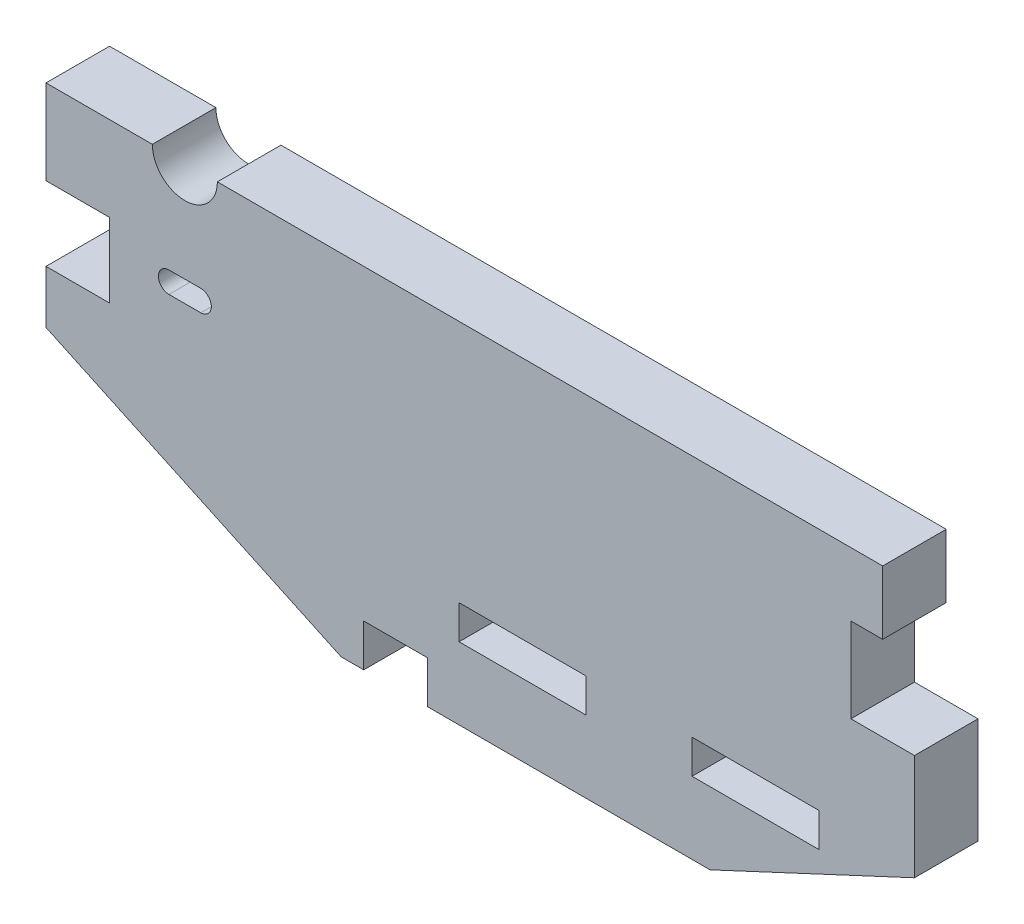
ISO-10303-21;
HEADER;
FILE_DESCRIPTION(('STEP AP214'),'2;1');
FILE_NAME('part.step','',(''),(''),'','','');
FILE_SCHEMA(('AUTOMOTIVE_DESIGN { 1 0 10303 214 1 1 1 1 }'));
ENDSEC;
DATA;
#1=APPLICATION_CONTEXT('core data for automotive mechanical design processes');
#2=APPLICATION_PROTOCOL_DEFINITION('international standard','automotive_design',2000,#1);
#3=PRODUCT_CONTEXT('',#1,'mechanical');
#4=PRODUCT('Part','Part','',(#3));
#5=PRODUCT_RELATED_PRODUCT_CATEGORY('part','',(#4));
#6=PRODUCT_DEFINITION_FORMATION('','',#4);
#7=PRODUCT_DEFINITION_CONTEXT('part definition',#1,'design');
#8=PRODUCT_DEFINITION('design','',#6,#7);
#9=PRODUCT_DEFINITION_SHAPE('','',#8);
#10=(LENGTH_UNIT() NAMED_UNIT(*) SI_UNIT(.MILLI.,.METRE.));
#11=(NAMED_UNIT(*) PLANE_ANGLE_UNIT() SI_UNIT($,.RADIAN.));
#12=(NAMED_UNIT(*) SI_UNIT($,.STERADIAN.) SOLID_ANGLE_UNIT());
#13=UNCERTAINTY_MEASURE_WITH_UNIT(LENGTH_MEASURE(1.E-05),#10,'distance_accuracy_value','');
#14=(GEOMETRIC_REPRESENTATION_CONTEXT(3) GLOBAL_UNCERTAINTY_ASSIGNED_CONTEXT((#13)) GLOBAL_UNIT_ASSIGNED_CONTEXT((#10,
#11,#12)) REPRESENTATION_CONTEXT('',''));
#15=CARTESIAN_POINT('',(0.,0.,0.));
#16=DIRECTION('',(0.,0.,1.));
#17=DIRECTION('',(1.,0.,0.));
#18=AXIS2_PLACEMENT_3D('',#15,#16,#17);
#19=CARTESIAN_POINT('',(0.,0.,6.));
#20=DIRECTION('',(0.,1.,0.));
#21=DIRECTION('',(0.,0.,1.));
#22=AXIS2_PLACEMENT_3D('',#19,#20,#21);
#23=PLANE('',#22);
#24=DIRECTION('',(1.,0.,0.));
#25=VECTOR('',#24,1.);
#26=CARTESIAN_POINT('',(0.,0.,0.));
#27=LINE('',#26,#25);
#28=CARTESIAN_POINT('',(27.8785899666242,0.,0.));
#29=VERTEX_POINT('',#28);
#30=CARTESIAN_POINT('',(30.0000000000057,0.,0.));
#31=VERTEX_POINT('',#30);
#32=EDGE_CURVE('E412',#29,#31,#27,.T.);
#33=ORIENTED_EDGE('',*,*,#32,.T.);
#34=DIRECTION('',(0.,0.,1.));
#35=VECTOR('',#34,1.);
#36=CARTESIAN_POINT('',(30.0000000000057,0.,6.));
#37=LINE('',#36,#35);
#38=CARTESIAN_POINT('',(30.0000000000057,0.,6.));
#39=VERTEX_POINT('',#38);
#40=EDGE_CURVE('E257',#31,#39,#37,.T.);
#41=ORIENTED_EDGE('',*,*,#40,.T.);
#42=DIRECTION('',(1.,0.,0.));
#43=VECTOR('',#42,1.);
#44=CARTESIAN_POINT('',(0.,0.,6.));
#45=LINE('',#44,#43);
#46=CARTESIAN_POINT('',(27.8785899666242,0.,6.));
#47=VERTEX_POINT('',#46);
#48=EDGE_CURVE('E398',#47,#39,#45,.T.);
#49=ORIENTED_EDGE('',*,*,#48,.F.);
#50=DIRECTION('',(0.,0.,-1.));
#51=VECTOR('',#50,1.);
#52=CARTESIAN_POINT('',(27.8785899666242,0.,6.));
#53=LINE('',#52,#51);
#54=EDGE_CURVE('E431',#47,#29,#53,.T.);
#55=ORIENTED_EDGE('',*,*,#54,.T.);
#56=EDGE_LOOP('',(#33,#41,#49,#55));
#57=FACE_BOUND('',#56,.T.);
#58=ADVANCED_FACE('F35',(#57),#23,.F.);
#59=CARTESIAN_POINT('',(0.,33.,6.));
#60=DIRECTION('',(0.,-1.,0.));
#61=DIRECTION('',(0.,0.,-1.));
#62=AXIS2_PLACEMENT_3D('',#59,#60,#61);
#63=PLANE('',#62);
#64=DIRECTION('',(-1.,0.,0.));
#65=VECTOR('',#64,1.);
#66=CARTESIAN_POINT('',(0.,33.,0.));
#67=LINE('',#66,#65);
#68=CARTESIAN_POINT('',(79.,33.,0.));
#69=VERTEX_POINT('',#68);
#70=CARTESIAN_POINT('',(16.1803487705082,33.,0.));
#71=VERTEX_POINT('',#70);
#72=EDGE_CURVE('E417',#69,#71,#67,.T.);
#73=ORIENTED_EDGE('',*,*,#72,.T.);
#74=DIRECTION('',(0.,0.,1.));
#75=VECTOR('',#74,1.);
#76=CARTESIAN_POINT('',(16.1803487705082,33.,-4.));
#77=LINE('',#76,#75);
#78=CARTESIAN_POINT('',(16.1803487705082,33.,6.));
#79=VERTEX_POINT('',#78);
#80=EDGE_CURVE('E300',#71,#79,#77,.T.);
#81=ORIENTED_EDGE('',*,*,#80,.T.);
#82=DIRECTION('',(-1.,0.,0.));
#83=VECTOR('',#82,1.);
#84=CARTESIAN_POINT('',(0.,33.,6.));
#85=LINE('',#84,#83);
#86=CARTESIAN_POINT('',(79.,33.,6.));
#87=VERTEX_POINT('',#86);
#88=EDGE_CURVE('E404',#87,#79,#85,.T.);
#89=ORIENTED_EDGE('',*,*,#88,.F.);
#90=DIRECTION('',(0.,0.,1.));
#91=VECTOR('',#90,1.);
#92=CARTESIAN_POINT('',(79.,33.,-4.));
#93=LINE('',#92,#91);
#94=EDGE_CURVE('E381',#69,#87,#93,.T.);
#95=ORIENTED_EDGE('',*,*,#94,.F.);
#96=EDGE_LOOP('',(#73,#81,#89,#95));
#97=FACE_BOUND('',#96,.T.);
#98=ADVANCED_FACE('F508',(#97),#63,.F.);
#99=CARTESIAN_POINT('',(0.,0.,6.));
#100=DIRECTION('',(1.,0.,0.));
#101=DIRECTION('',(0.,0.,-1.));
#102=AXIS2_PLACEMENT_3D('',#99,#100,#101);
#103=PLANE('',#102);
#104=DIRECTION('',(0.,-1.,0.));
#105=VECTOR('',#104,1.);
#106=CARTESIAN_POINT('',(0.,0.,0.));
#107=LINE('',#106,#105);
#108=CARTESIAN_POINT('',(0.,33.,0.));
#109=VERTEX_POINT('',#108);
#110=CARTESIAN_POINT('',(0.,25.,0.));
#111=VERTEX_POINT('',#110);
#112=EDGE_CURVE('E408',#109,#111,#107,.T.);
#113=ORIENTED_EDGE('',*,*,#112,.T.);
#114=DIRECTION('',(0.,0.,1.));
#115=VECTOR('',#114,1.);
#116=CARTESIAN_POINT('',(0.,25.,0.));
#117=LINE('',#116,#115);
#118=CARTESIAN_POINT('',(0.,25.,6.));
#119=VERTEX_POINT('',#118);
#120=EDGE_CURVE('E361',#111,#119,#117,.T.);
#121=ORIENTED_EDGE('',*,*,#120,.T.);
#122=DIRECTION('',(0.,-1.,0.));
#123=VECTOR('',#122,1.);
#124=CARTESIAN_POINT('',(0.,0.,6.));
#125=LINE('',#124,#123);
#126=CARTESIAN_POINT('',(0.,33.,6.));
#127=VERTEX_POINT('',#126);
#128=EDGE_CURVE('E393',#127,#119,#125,.T.);
#129=ORIENTED_EDGE('',*,*,#128,.F.);
#130=DIRECTION('',(0.,0.,-1.));
#131=VECTOR('',#130,1.);
#132=CARTESIAN_POINT('',(0.,33.,6.));
#133=LINE('',#132,#131);
#134=EDGE_CURVE('E407',#127,#109,#133,.T.);
#135=ORIENTED_EDGE('',*,*,#134,.T.);
#136=EDGE_LOOP('',(#113,#121,#129,#135));
#137=FACE_BOUND('',#136,.T.);
#138=ADVANCED_FACE('F515',(#137),#103,.F.);
#139=CARTESIAN_POINT('',(0.,18.,0.));
#140=VERTEX_POINT('',#139);
#141=CARTESIAN_POINT('',(0.,13.,0.));
#142=VERTEX_POINT('',#141);
#143=EDGE_CURVE('E385',#140,#142,#107,.T.);
#144=ORIENTED_EDGE('',*,*,#143,.T.);
#145=DIRECTION('',(0.,0.,1.));
#146=VECTOR('',#145,1.);
#147=CARTESIAN_POINT('',(0.,13.,6.));
#148=LINE('',#147,#146);
#149=CARTESIAN_POINT('',(0.,13.,6.));
#150=VERTEX_POINT('',#149);
#151=EDGE_CURVE('E436',#142,#150,#148,.T.);
#152=ORIENTED_EDGE('',*,*,#151,.T.);
#153=CARTESIAN_POINT('',(0.,18.,6.));
#154=VERTEX_POINT('',#153);
#155=EDGE_CURVE('E397',#154,#150,#125,.T.);
#156=ORIENTED_EDGE('',*,*,#155,.F.);
#157=DIRECTION('',(0.,0.,1.));
#158=VECTOR('',#157,1.);
#159=CARTESIAN_POINT('',(0.,18.,0.));
#160=LINE('',#159,#158);
#161=EDGE_CURVE('E354',#140,#154,#160,.T.);
#162=ORIENTED_EDGE('',*,*,#161,.F.);
#163=EDGE_LOOP('',(#144,#152,#156,#162));
#164=FACE_BOUND('',#163,.T.);
#165=ADVANCED_FACE('F523',(#164),#103,.F.);
#166=CARTESIAN_POINT('',(36.0000000000057,0.,6.));
#167=VERTEX_POINT('',#166);
#168=CARTESIAN_POINT('',(62.699437715414,0.,6.));
#169=VERTEX_POINT('',#168);
#170=EDGE_CURVE('E396',#167,#169,#45,.T.);
#171=ORIENTED_EDGE('',*,*,#170,.F.);
#172=DIRECTION('',(0.,0.,-1.));
#173=VECTOR('',#172,1.);
#174=CARTESIAN_POINT('',(36.0000000000057,0.,6.));
#175=LINE('',#174,#173);
#176=CARTESIAN_POINT('',(36.0000000000057,0.,0.));
#177=VERTEX_POINT('',#176);
#178=EDGE_CURVE('E250',#167,#177,#175,.T.);
#179=ORIENTED_EDGE('',*,*,#178,.T.);
#180=CARTESIAN_POINT('',(62.699437715414,0.,0.));
#181=VERTEX_POINT('',#180);
#182=EDGE_CURVE('E411',#177,#181,#27,.T.);
#183=ORIENTED_EDGE('',*,*,#182,.T.);
#184=DIRECTION('',(0.,0.,1.));
#185=VECTOR('',#184,1.);
#186=CARTESIAN_POINT('',(62.699437715414,0.,6.));
#187=LINE('',#186,#185);
#188=EDGE_CURVE('E446',#181,#169,#187,.T.);
#189=ORIENTED_EDGE('',*,*,#188,.T.);
#190=EDGE_LOOP('',(#171,#179,#183,#189));
#191=FACE_BOUND('',#190,.T.);
#192=ADVANCED_FACE('F511',(#191),#23,.F.);
#193=CARTESIAN_POINT('',(82.,0.,6.));
#194=DIRECTION('',(-1.,0.,0.));
#195=DIRECTION('',(0.,0.,1.));
#196=AXIS2_PLACEMENT_3D('',#193,#194,#195);
#197=PLANE('',#196);
#198=DIRECTION('',(0.,1.,0.));
#199=VECTOR('',#198,1.);
#200=CARTESIAN_POINT('',(82.,0.,6.));
#201=LINE('',#200,#199);
#202=CARTESIAN_POINT('',(82.,9.00000000000001,6.));
#203=VERTEX_POINT('',#202);
#204=CARTESIAN_POINT('',(82.,19.,6.));
#205=VERTEX_POINT('',#204);
#206=EDGE_CURVE('E401',#203,#205,#201,.T.);
#207=ORIENTED_EDGE('',*,*,#206,.F.);
#208=DIRECTION('',(0.,0.,-1.));
#209=VECTOR('',#208,1.);
#210=CARTESIAN_POINT('',(82.,9.00000000000001,6.));
#211=LINE('',#210,#209);
#212=CARTESIAN_POINT('',(82.,9.00000000000001,0.));
#213=VERTEX_POINT('',#212);
#214=EDGE_CURVE('E440',#203,#213,#211,.T.);
#215=ORIENTED_EDGE('',*,*,#214,.T.);
#216=DIRECTION('',(0.,1.,0.));
#217=VECTOR('',#216,1.);
#218=CARTESIAN_POINT('',(82.,0.,0.));
#219=LINE('',#218,#217);
#220=CARTESIAN_POINT('',(82.,19.,0.));
#221=VERTEX_POINT('',#220);
#222=EDGE_CURVE('E414',#213,#221,#219,.T.);
#223=ORIENTED_EDGE('',*,*,#222,.T.);
#224=DIRECTION('',(0.,0.,1.));
#225=VECTOR('',#224,1.);
#226=CARTESIAN_POINT('',(82.,19.,-4.));
#227=LINE('',#226,#225);
#228=EDGE_CURVE('E382',#221,#205,#227,.T.);
#229=ORIENTED_EDGE('',*,*,#228,.T.);
#230=EDGE_LOOP('',(#207,#215,#223,#229));
#231=FACE_BOUND('',#230,.T.);
#232=ADVANCED_FACE('F522',(#231),#197,.F.);
#233=CARTESIAN_POINT('',(10.0402513180558,33.,6.));
#234=VERTEX_POINT('',#233);
#235=EDGE_CURVE('E403',#234,#127,#85,.T.);
#236=ORIENTED_EDGE('',*,*,#235,.F.);
#237=DIRECTION('',(0.,0.,1.));
#238=VECTOR('',#237,1.);
#239=CARTESIAN_POINT('',(10.0402513180558,33.,-4.));
#240=LINE('',#239,#238);
#241=CARTESIAN_POINT('',(10.0402513180558,33.,0.));
#242=VERTEX_POINT('',#241);
#243=EDGE_CURVE('E291',#234,#242,#240,.F.);
#244=ORIENTED_EDGE('',*,*,#243,.T.);
#245=EDGE_CURVE('E416',#242,#109,#67,.T.);
#246=ORIENTED_EDGE('',*,*,#245,.T.);
#247=ORIENTED_EDGE('',*,*,#134,.F.);
#248=EDGE_LOOP('',(#236,#244,#246,#247));
#249=FACE_BOUND('',#248,.T.);
#250=ADVANCED_FACE('F518',(#249),#63,.F.);
#251=CARTESIAN_POINT('',(0.,0.,6.));
#252=DIRECTION('',(0.,0.,-1.));
#253=DIRECTION('',(-1.,0.,0.));
#254=AXIS2_PLACEMENT_3D('',#251,#252,#253);
#255=PLANE('',#254);
#256=DIRECTION('',(1.,0.,0.));
#257=VECTOR('',#256,1.);
#258=CARTESIAN_POINT('',(11.610300044282,21.5090873537113,6.));
#259=LINE('',#258,#257);
#260=CARTESIAN_POINT('',(11.610300044282,21.5090873537113,6.));
#261=VERTEX_POINT('',#260);
#262=CARTESIAN_POINT('',(14.610300044282,21.5090873537113,6.));
#263=VERTEX_POINT('',#262);
#264=EDGE_CURVE('E279',#261,#263,#259,.T.);
#265=ORIENTED_EDGE('',*,*,#264,.F.);
#266=CARTESIAN_POINT('',(11.610300044282,22.5090873537113,6.));
#267=DIRECTION('',(0.,0.,1.));
#268=DIRECTION('',(1.,0.,0.));
#269=AXIS2_PLACEMENT_3D('',#266,#267,#268);
#270=CIRCLE('',#269,1.);
#271=CARTESIAN_POINT('',(11.610300044282,23.5090873537113,6.));
#272=VERTEX_POINT('',#271);
#273=EDGE_CURVE('E58',#272,#261,#270,.T.);
#274=ORIENTED_EDGE('',*,*,#273,.F.);
#275=DIRECTION('',(-1.,0.,0.));
#276=VECTOR('',#275,1.);
#277=CARTESIAN_POINT('',(11.610300044282,23.5090873537113,6.));
#278=LINE('',#277,#276);
#279=CARTESIAN_POINT('',(14.610300044282,23.5090873537113,6.));
#280=VERTEX_POINT('',#279);
#281=EDGE_CURVE('E285',#280,#272,#278,.T.);
#282=ORIENTED_EDGE('',*,*,#281,.F.);
#283=CARTESIAN_POINT('',(14.610300044282,22.5090873537113,6.));
#284=DIRECTION('',(0.,0.,1.));
#285=DIRECTION('',(1.,0.,0.));
#286=AXIS2_PLACEMENT_3D('',#283,#284,#285);
#287=CIRCLE('',#286,1.);
#288=EDGE_CURVE('E282',#263,#280,#287,.T.);
#289=ORIENTED_EDGE('',*,*,#288,.F.);
#290=EDGE_LOOP('',(#265,#274,#282,#289));
#291=FACE_BOUND('',#290,.T.);
#292=DIRECTION('',(1.,0.,0.));
#293=VECTOR('',#292,1.);
#294=CARTESIAN_POINT('',(61.0000000000057,6.79999999998872,6.));
#295=LINE('',#294,#293);
#296=CARTESIAN_POINT('',(61.0000000000057,6.79999999998872,6.));
#297=VERTEX_POINT('',#296);
#298=CARTESIAN_POINT('',(73.0000000000057,6.79999999998872,6.));
#299=VERTEX_POINT('',#298);
#300=EDGE_CURVE('E305',#297,#299,#295,.T.);
#301=ORIENTED_EDGE('',*,*,#300,.F.);
#302=DIRECTION('',(0.,-1.,0.));
#303=VECTOR('',#302,1.);
#304=CARTESIAN_POINT('',(61.0000000000057,9.99999999998872,6.));
#305=LINE('',#304,#303);
#306=CARTESIAN_POINT('',(61.0000000000057,9.99999999998872,6.));
#307=VERTEX_POINT('',#306);
#308=EDGE_CURVE('E303',#307,#297,#305,.T.);
#309=ORIENTED_EDGE('',*,*,#308,.F.);
#310=DIRECTION('',(-1.,0.,0.));
#311=VECTOR('',#310,1.);
#312=CARTESIAN_POINT('',(61.0000000000057,9.99999999998872,6.));
#313=LINE('',#312,#311);
#314=CARTESIAN_POINT('',(73.0000000000057,9.99999999998872,6.));
#315=VERTEX_POINT('',#314);
#316=EDGE_CURVE('E311',#315,#307,#313,.T.);
#317=ORIENTED_EDGE('',*,*,#316,.F.);
#318=DIRECTION('',(0.,1.,0.));
#319=VECTOR('',#318,1.);
#320=CARTESIAN_POINT('',(73.0000000000057,9.99999999998872,6.));
#321=LINE('',#320,#319);
#322=EDGE_CURVE('E308',#299,#315,#321,.T.);
#323=ORIENTED_EDGE('',*,*,#322,.F.);
#324=EDGE_LOOP('',(#301,#309,#317,#323));
#325=FACE_BOUND('',#324,.T.);
#326=DIRECTION('',(1.,0.,0.));
#327=VECTOR('',#326,1.);
#328=CARTESIAN_POINT('',(39.0000000000057,6.79999999998872,6.));
#329=LINE('',#328,#327);
#330=CARTESIAN_POINT('',(39.0000000000057,6.79999999998872,6.));
#331=VERTEX_POINT('',#330);
#332=CARTESIAN_POINT('',(51.0000000000057,6.79999999998872,6.));
#333=VERTEX_POINT('',#332);
#334=EDGE_CURVE('E325',#331,#333,#329,.T.);
#335=ORIENTED_EDGE('',*,*,#334,.F.);
#336=DIRECTION('',(0.,-1.,0.));
#337=VECTOR('',#336,1.);
#338=CARTESIAN_POINT('',(39.0000000000057,9.99999999998872,6.));
#339=LINE('',#338,#337);
#340=CARTESIAN_POINT('',(39.0000000000057,9.99999999998872,6.));
#341=VERTEX_POINT('',#340);
#342=EDGE_CURVE('E317',#341,#331,#339,.T.);
#343=ORIENTED_EDGE('',*,*,#342,.F.);
#344=DIRECTION('',(-1.,0.,0.));
#345=VECTOR('',#344,1.);
#346=CARTESIAN_POINT('',(39.0000000000057,9.99999999998872,6.));
#347=LINE('',#346,#345);
#348=CARTESIAN_POINT('',(51.0000000000057,9.99999999998872,6.));
#349=VERTEX_POINT('',#348);
#350=EDGE_CURVE('E331',#349,#341,#347,.T.);
#351=ORIENTED_EDGE('',*,*,#350,.F.);
#352=DIRECTION('',(0.,1.,0.));
#353=VECTOR('',#352,1.);
#354=CARTESIAN_POINT('',(51.0000000000057,9.99999999998872,6.));
#355=LINE('',#354,#353);
#356=EDGE_CURVE('E328',#333,#349,#355,.T.);
#357=ORIENTED_EDGE('',*,*,#356,.F.);
#358=EDGE_LOOP('',(#335,#343,#351,#357));
#359=FACE_BOUND('',#358,.T.);
#360=ORIENTED_EDGE('',*,*,#48,.T.);
#361=DIRECTION('',(0.,-1.,0.));
#362=VECTOR('',#361,1.);
#363=CARTESIAN_POINT('',(30.0000000000058,-5.00000000000955,6.));
#364=LINE('',#363,#362);
#365=CARTESIAN_POINT('',(30.0000000000056,4.,6.));
#366=VERTEX_POINT('',#365);
#367=EDGE_CURVE('E269',#366,#39,#364,.T.);
#368=ORIENTED_EDGE('',*,*,#367,.F.);
#369=DIRECTION('',(-1.,0.,0.));
#370=VECTOR('',#369,1.);
#371=CARTESIAN_POINT('',(30.0000000000056,4.,6.));
#372=LINE('',#371,#370);
#373=CARTESIAN_POINT('',(36.0000000000056,4.,6.));
#374=VERTEX_POINT('',#373);
#375=EDGE_CURVE('E247',#374,#366,#372,.T.);
#376=ORIENTED_EDGE('',*,*,#375,.F.);
#377=DIRECTION('',(0.,1.,0.));
#378=VECTOR('',#377,1.);
#379=CARTESIAN_POINT('',(36.0000000000057,-5.00000000000955,6.));
#380=LINE('',#379,#378);
#381=EDGE_CURVE('E271',#167,#374,#380,.T.);
#382=ORIENTED_EDGE('',*,*,#381,.F.);
#383=ORIENTED_EDGE('',*,*,#170,.T.);
#384=DIRECTION('',(-0.90630778703665,-0.4226182617407,0.));
#385=VECTOR('',#384,1.);
#386=CARTESIAN_POINT('',(82.,9.00000000000001,6.));
#387=LINE('',#386,#385);
#388=EDGE_CURVE('E449',#169,#203,#387,.F.);
#389=ORIENTED_EDGE('',*,*,#388,.T.);
#390=ORIENTED_EDGE('',*,*,#206,.T.);
#391=DIRECTION('',(1.,0.,0.));
#392=VECTOR('',#391,1.);
#393=CARTESIAN_POINT('',(76.,19.,6.));
#394=LINE('',#393,#392);
#395=CARTESIAN_POINT('',(76.,19.,6.));
#396=VERTEX_POINT('',#395);
#397=EDGE_CURVE('E378',#396,#205,#394,.T.);
#398=ORIENTED_EDGE('',*,*,#397,.F.);
#399=DIRECTION('',(0.,-1.,0.));
#400=VECTOR('',#399,1.);
#401=CARTESIAN_POINT('',(76.,27.,6.));
#402=LINE('',#401,#400);
#403=CARTESIAN_POINT('',(76.,27.,6.));
#404=VERTEX_POINT('',#403);
#405=EDGE_CURVE('E375',#404,#396,#402,.T.);
#406=ORIENTED_EDGE('',*,*,#405,.F.);
#407=DIRECTION('',(-1.,0.,0.));
#408=VECTOR('',#407,1.);
#409=CARTESIAN_POINT('',(79.,27.,6.));
#410=LINE('',#409,#408);
#411=CARTESIAN_POINT('',(79.,27.,6.));
#412=VERTEX_POINT('',#411);
#413=EDGE_CURVE('E372',#412,#404,#410,.T.);
#414=ORIENTED_EDGE('',*,*,#413,.F.);
#415=DIRECTION('',(0.,-1.,0.));
#416=VECTOR('',#415,1.);
#417=CARTESIAN_POINT('',(79.,33.,6.));
#418=LINE('',#417,#416);
#419=EDGE_CURVE('E364',#87,#412,#418,.T.);
#420=ORIENTED_EDGE('',*,*,#419,.F.);
#421=ORIENTED_EDGE('',*,*,#88,.T.);
#422=CARTESIAN_POINT('',(13.110300044282,33.,6.));
#423=DIRECTION('',(0.,0.,1.));
#424=DIRECTION('',(1.,0.,0.));
#425=AXIS2_PLACEMENT_3D('',#422,#423,#424);
#426=CIRCLE('',#425,3.07004872622623);
#427=EDGE_CURVE('E277',#234,#79,#426,.T.);
#428=ORIENTED_EDGE('',*,*,#427,.F.);
#429=ORIENTED_EDGE('',*,*,#235,.T.);
#430=ORIENTED_EDGE('',*,*,#128,.T.);
#431=DIRECTION('',(-1.,0.,0.));
#432=VECTOR('',#431,1.);
#433=CARTESIAN_POINT('',(0.,25.,6.));
#434=LINE('',#433,#432);
#435=CARTESIAN_POINT('',(6.,25.,6.));
#436=VERTEX_POINT('',#435);
#437=EDGE_CURVE('E348',#436,#119,#434,.T.);
#438=ORIENTED_EDGE('',*,*,#437,.F.);
#439=DIRECTION('',(0.,1.,0.));
#440=VECTOR('',#439,1.);
#441=CARTESIAN_POINT('',(6.,25.,6.));
#442=LINE('',#441,#440);
#443=CARTESIAN_POINT('',(6.,18.,6.));
#444=VERTEX_POINT('',#443);
#445=EDGE_CURVE('E357',#444,#436,#442,.T.);
#446=ORIENTED_EDGE('',*,*,#445,.F.);
#447=DIRECTION('',(1.,0.,0.));
#448=VECTOR('',#447,1.);
#449=CARTESIAN_POINT('',(0.,18.,6.));
#450=LINE('',#449,#448);
#451=EDGE_CURVE('E337',#154,#444,#450,.T.);
#452=ORIENTED_EDGE('',*,*,#451,.F.);
#453=ORIENTED_EDGE('',*,*,#155,.T.);
#454=DIRECTION('',(-0.906307787036649,0.4226182617407,0.));
#455=VECTOR('',#454,1.);
#456=CARTESIAN_POINT('',(27.8785899666242,0.,6.));
#457=LINE('',#456,#455);
#458=EDGE_CURVE('E438',#150,#47,#457,.F.);
#459=ORIENTED_EDGE('',*,*,#458,.T.);
#460=EDGE_LOOP('',(#360,#368,#376,#382,#383,#389,#390,#398,#406,#414,#420,#421,#428,#429,#430,
#438,#446,#452,#453,#459));
#461=FACE_BOUND('',#460,.T.);
#462=ADVANCED_FACE('F493',(#291,#325,#359,#461),#255,.F.);
#463=CARTESIAN_POINT('',(0.,0.,0.));
#464=DIRECTION('',(0.,0.,-1.));
#465=DIRECTION('',(-1.,0.,0.));
#466=AXIS2_PLACEMENT_3D('',#463,#464,#465);
#467=PLANE('',#466);
#468=DIRECTION('',(0.,-1.,0.));
#469=VECTOR('',#468,1.);
#470=CARTESIAN_POINT('',(30.0000000000058,-5.00000000000955,0.));
#471=LINE('',#470,#469);
#472=CARTESIAN_POINT('',(30.0000000000056,4.,0.));
#473=VERTEX_POINT('',#472);
#474=EDGE_CURVE('E254',#473,#31,#471,.T.);
#475=ORIENTED_EDGE('',*,*,#474,.T.);
#476=ORIENTED_EDGE('',*,*,#32,.F.);
#477=DIRECTION('',(0.906307787036649,-0.4226182617407,0.));
#478=VECTOR('',#477,1.);
#479=CARTESIAN_POINT('',(4.97928888027337,10.6781194629625,0.));
#480=LINE('',#479,#478);
#481=EDGE_CURVE('E434',#29,#142,#480,.F.);
#482=ORIENTED_EDGE('',*,*,#481,.T.);
#483=ORIENTED_EDGE('',*,*,#143,.F.);
#484=DIRECTION('',(1.,0.,0.));
#485=VECTOR('',#484,1.);
#486=CARTESIAN_POINT('',(0.,18.,0.));
#487=LINE('',#486,#485);
#488=CARTESIAN_POINT('',(6.,18.,0.));
#489=VERTEX_POINT('',#488);
#490=EDGE_CURVE('E344',#140,#489,#487,.T.);
#491=ORIENTED_EDGE('',*,*,#490,.T.);
#492=DIRECTION('',(0.,1.,0.));
#493=VECTOR('',#492,1.);
#494=CARTESIAN_POINT('',(6.,25.,0.));
#495=LINE('',#494,#493);
#496=CARTESIAN_POINT('',(6.,25.,0.));
#497=VERTEX_POINT('',#496);
#498=EDGE_CURVE('E347',#489,#497,#495,.T.);
#499=ORIENTED_EDGE('',*,*,#498,.T.);
#500=DIRECTION('',(-1.,0.,0.));
#501=VECTOR('',#500,1.);
#502=CARTESIAN_POINT('',(0.,25.,0.));
#503=LINE('',#502,#501);
#504=EDGE_CURVE('E351',#497,#111,#503,.T.);
#505=ORIENTED_EDGE('',*,*,#504,.T.);
#506=ORIENTED_EDGE('',*,*,#112,.F.);
#507=ORIENTED_EDGE('',*,*,#245,.F.);
#508=CARTESIAN_POINT('',(13.110300044282,33.,0.));
#509=DIRECTION('',(0.,0.,-1.));
#510=DIRECTION('',(-1.,0.,0.));
#511=AXIS2_PLACEMENT_3D('',#508,#509,#510);
#512=CIRCLE('',#511,3.07004872622623);
#513=EDGE_CURVE('E469',#71,#242,#512,.T.);
#514=ORIENTED_EDGE('',*,*,#513,.F.);
#515=ORIENTED_EDGE('',*,*,#72,.F.);
#516=DIRECTION('',(0.,1.,0.));
#517=VECTOR('',#516,1.);
#518=CARTESIAN_POINT('',(79.,0.,0.));
#519=LINE('',#518,#517);
#520=CARTESIAN_POINT('',(79.,27.,0.));
#521=VERTEX_POINT('',#520);
#522=EDGE_CURVE('E422',#521,#69,#519,.T.);
#523=ORIENTED_EDGE('',*,*,#522,.F.);
#524=DIRECTION('',(1.,0.,0.));
#525=VECTOR('',#524,1.);
#526=CARTESIAN_POINT('',(0.,27.,0.));
#527=LINE('',#526,#525);
#528=CARTESIAN_POINT('',(76.,27.,0.));
#529=VERTEX_POINT('',#528);
#530=EDGE_CURVE('E424',#529,#521,#527,.T.);
#531=ORIENTED_EDGE('',*,*,#530,.F.);
#532=DIRECTION('',(0.,1.,0.));
#533=VECTOR('',#532,1.);
#534=CARTESIAN_POINT('',(76.,0.,0.));
#535=LINE('',#534,#533);
#536=CARTESIAN_POINT('',(76.,19.,0.));
#537=VERTEX_POINT('',#536);
#538=EDGE_CURVE('E427',#537,#529,#535,.T.);
#539=ORIENTED_EDGE('',*,*,#538,.F.);
#540=DIRECTION('',(-1.,0.,0.));
#541=VECTOR('',#540,1.);
#542=CARTESIAN_POINT('',(0.,19.,0.));
#543=LINE('',#542,#541);
#544=EDGE_CURVE('E429',#221,#537,#543,.T.);
#545=ORIENTED_EDGE('',*,*,#544,.F.);
#546=ORIENTED_EDGE('',*,*,#222,.F.);
#547=DIRECTION('',(0.90630778703665,0.4226182617407,0.));
#548=VECTOR('',#547,1.);
#549=CARTESIAN_POINT('',(11.1985080088165,-24.0152779242887,0.));
#550=LINE('',#549,#548);
#551=EDGE_CURVE('E443',#213,#181,#550,.F.);
#552=ORIENTED_EDGE('',*,*,#551,.T.);
#553=ORIENTED_EDGE('',*,*,#182,.F.);
#554=DIRECTION('',(0.,-1.,0.));
#555=VECTOR('',#554,1.);
#556=CARTESIAN_POINT('',(36.0000000000057,4.44089209849662E-13,0.));
#557=LINE('',#556,#555);
#558=CARTESIAN_POINT('',(36.0000000000056,4.,0.));
#559=VERTEX_POINT('',#558);
#560=EDGE_CURVE('E11',#559,#177,#557,.T.);
#561=ORIENTED_EDGE('',*,*,#560,.F.);
#562=DIRECTION('',(-1.,0.,0.));
#563=VECTOR('',#562,1.);
#564=CARTESIAN_POINT('',(30.0000000000056,4.,0.));
#565=LINE('',#564,#563);
#566=EDGE_CURVE('E50',#559,#473,#565,.T.);
#567=ORIENTED_EDGE('',*,*,#566,.T.);
#568=EDGE_LOOP('',(#475,#476,#482,#483,#491,#499,#505,#506,#507,#514,#515,#523,#531,#539,#545,
#546,#552,#553,#561,#567));
#569=FACE_BOUND('',#568,.T.);
#570=CARTESIAN_POINT('',(11.610300044282,22.5090873537113,0.));
#571=DIRECTION('',(0.,0.,-1.));
#572=DIRECTION('',(-1.,0.,0.));
#573=AXIS2_PLACEMENT_3D('',#570,#571,#572);
#574=CIRCLE('',#573,1.);
#575=CARTESIAN_POINT('',(11.610300044282,21.5090873537113,0.));
#576=VERTEX_POINT('',#575);
#577=CARTESIAN_POINT('',(11.610300044282,23.5090873537113,0.));
#578=VERTEX_POINT('',#577);
#579=EDGE_CURVE('E43',#576,#578,#574,.T.);
#580=ORIENTED_EDGE('',*,*,#579,.F.);
#581=DIRECTION('',(-1.,0.,0.));
#582=VECTOR('',#581,1.);
#583=CARTESIAN_POINT('',(0.,21.5090873537113,0.));
#584=LINE('',#583,#582);
#585=CARTESIAN_POINT('',(14.610300044282,21.5090873537113,0.));
#586=VERTEX_POINT('',#585);
#587=EDGE_CURVE('E471',#586,#576,#584,.T.);
#588=ORIENTED_EDGE('',*,*,#587,.F.);
#589=CARTESIAN_POINT('',(14.610300044282,22.5090873537113,0.));
#590=DIRECTION('',(0.,0.,-1.));
#591=DIRECTION('',(-1.,0.,0.));
#592=AXIS2_PLACEMENT_3D('',#589,#590,#591);
#593=CIRCLE('',#592,1.);
#594=CARTESIAN_POINT('',(14.610300044282,23.5090873537113,0.));
#595=VERTEX_POINT('',#594);
#596=EDGE_CURVE('E473',#595,#586,#593,.T.);
#597=ORIENTED_EDGE('',*,*,#596,.F.);
#598=DIRECTION('',(1.,0.,0.));
#599=VECTOR('',#598,1.);
#600=CARTESIAN_POINT('',(0.,23.5090873537113,0.));
#601=LINE('',#600,#599);
#602=EDGE_CURVE('E476',#578,#595,#601,.T.);
#603=ORIENTED_EDGE('',*,*,#602,.F.);
#604=EDGE_LOOP('',(#580,#588,#597,#603));
#605=FACE_BOUND('',#604,.T.);
#606=DIRECTION('',(0.,1.,0.));
#607=VECTOR('',#606,1.);
#608=CARTESIAN_POINT('',(61.0000000000057,0.,0.));
#609=LINE('',#608,#607);
#610=CARTESIAN_POINT('',(61.0000000000057,6.79999999998872,0.));
#611=VERTEX_POINT('',#610);
#612=CARTESIAN_POINT('',(61.0000000000057,9.99999999998872,0.));
#613=VERTEX_POINT('',#612);
#614=EDGE_CURVE('E467',#611,#613,#609,.T.);
#615=ORIENTED_EDGE('',*,*,#614,.F.);
#616=DIRECTION('',(-1.,0.,0.));
#617=VECTOR('',#616,1.);
#618=CARTESIAN_POINT('',(0.,6.79999999998872,0.));
#619=LINE('',#618,#617);
#620=CARTESIAN_POINT('',(73.0000000000057,6.79999999998872,0.));
#621=VERTEX_POINT('',#620);
#622=EDGE_CURVE('E460',#621,#611,#619,.T.);
#623=ORIENTED_EDGE('',*,*,#622,.F.);
#624=DIRECTION('',(0.,-1.,0.));
#625=VECTOR('',#624,1.);
#626=CARTESIAN_POINT('',(73.0000000000057,0.,0.));
#627=LINE('',#626,#625);
#628=CARTESIAN_POINT('',(73.0000000000057,9.99999999998872,0.));
#629=VERTEX_POINT('',#628);
#630=EDGE_CURVE('E462',#629,#621,#627,.T.);
#631=ORIENTED_EDGE('',*,*,#630,.F.);
#632=DIRECTION('',(1.,0.,0.));
#633=VECTOR('',#632,1.);
#634=CARTESIAN_POINT('',(0.,9.99999999998872,0.));
#635=LINE('',#634,#633);
#636=EDGE_CURVE('E465',#613,#629,#635,.T.);
#637=ORIENTED_EDGE('',*,*,#636,.F.);
#638=EDGE_LOOP('',(#615,#623,#631,#637));
#639=FACE_BOUND('',#638,.T.);
#640=DIRECTION('',(0.,1.,0.));
#641=VECTOR('',#640,1.);
#642=CARTESIAN_POINT('',(39.0000000000057,0.,0.));
#643=LINE('',#642,#641);
#644=CARTESIAN_POINT('',(39.0000000000057,6.79999999998872,0.));
#645=VERTEX_POINT('',#644);
#646=CARTESIAN_POINT('',(39.0000000000057,9.99999999998872,0.));
#647=VERTEX_POINT('',#646);
#648=EDGE_CURVE('E458',#645,#647,#643,.T.);
#649=ORIENTED_EDGE('',*,*,#648,.F.);
#650=DIRECTION('',(-1.,0.,0.));
#651=VECTOR('',#650,1.);
#652=CARTESIAN_POINT('',(0.,6.79999999998872,0.));
#653=LINE('',#652,#651);
#654=CARTESIAN_POINT('',(51.0000000000057,6.79999999998872,0.));
#655=VERTEX_POINT('',#654);
#656=EDGE_CURVE('E451',#655,#645,#653,.T.);
#657=ORIENTED_EDGE('',*,*,#656,.F.);
#658=DIRECTION('',(0.,-1.,0.));
#659=VECTOR('',#658,1.);
#660=CARTESIAN_POINT('',(51.0000000000057,0.,0.));
#661=LINE('',#660,#659);
#662=CARTESIAN_POINT('',(51.0000000000057,9.99999999998872,0.));
#663=VERTEX_POINT('',#662);
#664=EDGE_CURVE('E453',#663,#655,#661,.T.);
#665=ORIENTED_EDGE('',*,*,#664,.F.);
#666=DIRECTION('',(1.,0.,0.));
#667=VECTOR('',#666,1.);
#668=CARTESIAN_POINT('',(0.,9.99999999998872,0.));
#669=LINE('',#668,#667);
#670=EDGE_CURVE('E456',#647,#663,#669,.T.);
#671=ORIENTED_EDGE('',*,*,#670,.F.);
#672=EDGE_LOOP('',(#649,#657,#665,#671));
#673=FACE_BOUND('',#672,.T.);
#674=ADVANCED_FACE('F263',(#569,#605,#639,#673),#467,.T.);
#675=CARTESIAN_POINT('',(76.,19.,-4.));
#676=DIRECTION('',(0.,-1.,0.));
#677=DIRECTION('',(0.,0.,-1.));
#678=AXIS2_PLACEMENT_3D('',#675,#676,#677);
#679=PLANE('',#678);
#680=ORIENTED_EDGE('',*,*,#544,.T.);
#681=DIRECTION('',(0.,0.,1.));
#682=VECTOR('',#681,1.);
#683=CARTESIAN_POINT('',(76.,19.,-4.));
#684=LINE('',#683,#682);
#685=EDGE_CURVE('E386',#537,#396,#684,.T.);
#686=ORIENTED_EDGE('',*,*,#685,.T.);
#687=ORIENTED_EDGE('',*,*,#397,.T.);
#688=ORIENTED_EDGE('',*,*,#228,.F.);
#689=EDGE_LOOP('',(#680,#686,#687,#688));
#690=FACE_BOUND('',#689,.T.);
#691=ADVANCED_FACE('F602',(#690),#679,.F.);
#692=CARTESIAN_POINT('',(76.,27.,-4.));
#693=DIRECTION('',(-1.,0.,0.));
#694=DIRECTION('',(0.,0.,1.));
#695=AXIS2_PLACEMENT_3D('',#692,#693,#694);
#696=PLANE('',#695);
#697=ORIENTED_EDGE('',*,*,#538,.T.);
#698=DIRECTION('',(0.,0.,1.));
#699=VECTOR('',#698,1.);
#700=CARTESIAN_POINT('',(76.,27.,-4.));
#701=LINE('',#700,#699);
#702=EDGE_CURVE('E388',#529,#404,#701,.T.);
#703=ORIENTED_EDGE('',*,*,#702,.T.);
#704=ORIENTED_EDGE('',*,*,#405,.T.);
#705=ORIENTED_EDGE('',*,*,#685,.F.);
#706=EDGE_LOOP('',(#697,#703,#704,#705));
#707=FACE_BOUND('',#706,.T.);
#708=ADVANCED_FACE('F605',(#707),#696,.F.);
#709=CARTESIAN_POINT('',(79.,27.,-4.));
#710=DIRECTION('',(0.,1.,0.));
#711=DIRECTION('',(0.,0.,1.));
#712=AXIS2_PLACEMENT_3D('',#709,#710,#711);
#713=PLANE('',#712);
#714=ORIENTED_EDGE('',*,*,#530,.T.);
#715=DIRECTION('',(0.,0.,1.));
#716=VECTOR('',#715,1.);
#717=CARTESIAN_POINT('',(79.,27.,-4.));
#718=LINE('',#717,#716);
#719=EDGE_CURVE('E390',#521,#412,#718,.T.);
#720=ORIENTED_EDGE('',*,*,#719,.T.);
#721=ORIENTED_EDGE('',*,*,#413,.T.);
#722=ORIENTED_EDGE('',*,*,#702,.F.);
#723=EDGE_LOOP('',(#714,#720,#721,#722));
#724=FACE_BOUND('',#723,.T.);
#725=ADVANCED_FACE('F609',(#724),#713,.F.);
#726=CARTESIAN_POINT('',(79.,33.,-4.));
#727=DIRECTION('',(-1.,0.,0.));
#728=DIRECTION('',(0.,0.,1.));
#729=AXIS2_PLACEMENT_3D('',#726,#727,#728);
#730=PLANE('',#729);
#731=ORIENTED_EDGE('',*,*,#522,.T.);
#732=ORIENTED_EDGE('',*,*,#94,.T.);
#733=ORIENTED_EDGE('',*,*,#419,.T.);
#734=ORIENTED_EDGE('',*,*,#719,.F.);
#735=EDGE_LOOP('',(#731,#732,#733,#734));
#736=FACE_BOUND('',#735,.T.);
#737=ADVANCED_FACE('F592',(#736),#730,.F.);
#738=CARTESIAN_POINT('',(0.,25.,0.));
#739=DIRECTION('',(0.,1.,0.));
#740=DIRECTION('',(0.,0.,1.));
#741=AXIS2_PLACEMENT_3D('',#738,#739,#740);
#742=PLANE('',#741);
#743=ORIENTED_EDGE('',*,*,#437,.T.);
#744=ORIENTED_EDGE('',*,*,#120,.F.);
#745=ORIENTED_EDGE('',*,*,#504,.F.);
#746=DIRECTION('',(0.,0.,1.));
#747=VECTOR('',#746,1.);
#748=CARTESIAN_POINT('',(6.,25.,0.));
#749=LINE('',#748,#747);
#750=EDGE_CURVE('E365',#497,#436,#749,.T.);
#751=ORIENTED_EDGE('',*,*,#750,.T.);
#752=EDGE_LOOP('',(#743,#744,#745,#751));
#753=FACE_BOUND('',#752,.T.);
#754=ADVANCED_FACE('F588',(#753),#742,.F.);
#755=CARTESIAN_POINT('',(6.,25.,0.));
#756=DIRECTION('',(1.,0.,0.));
#757=DIRECTION('',(0.,1.,0.));
#758=AXIS2_PLACEMENT_3D('',#755,#756,#757);
#759=PLANE('',#758);
#760=ORIENTED_EDGE('',*,*,#445,.T.);
#761=ORIENTED_EDGE('',*,*,#750,.F.);
#762=ORIENTED_EDGE('',*,*,#498,.F.);
#763=DIRECTION('',(0.,0.,1.));
#764=VECTOR('',#763,1.);
#765=CARTESIAN_POINT('',(6.,18.,0.));
#766=LINE('',#765,#764);
#767=EDGE_CURVE('E367',#489,#444,#766,.T.);
#768=ORIENTED_EDGE('',*,*,#767,.T.);
#769=EDGE_LOOP('',(#760,#761,#762,#768));
#770=FACE_BOUND('',#769,.T.);
#771=ADVANCED_FACE('F591',(#770),#759,.F.);
#772=CARTESIAN_POINT('',(0.,18.,0.));
#773=DIRECTION('',(0.,-1.,0.));
#774=DIRECTION('',(0.,0.,-1.));
#775=AXIS2_PLACEMENT_3D('',#772,#773,#774);
#776=PLANE('',#775);
#777=ORIENTED_EDGE('',*,*,#451,.T.);
#778=ORIENTED_EDGE('',*,*,#767,.F.);
#779=ORIENTED_EDGE('',*,*,#490,.F.);
#780=ORIENTED_EDGE('',*,*,#161,.T.);
#781=EDGE_LOOP('',(#777,#778,#779,#780));
#782=FACE_BOUND('',#781,.T.);
#783=ADVANCED_FACE('F596',(#782),#776,.F.);
#784=CARTESIAN_POINT('',(27.8785899666242,0.,6.));
#785=DIRECTION('',(0.4226182617407,0.906307787036649,0.));
#786=DIRECTION('',(0.,0.,-1.));
#787=AXIS2_PLACEMENT_3D('',#784,#785,#786);
#788=PLANE('',#787);
#789=ORIENTED_EDGE('',*,*,#458,.F.);
#790=ORIENTED_EDGE('',*,*,#151,.F.);
#791=ORIENTED_EDGE('',*,*,#481,.F.);
#792=ORIENTED_EDGE('',*,*,#54,.F.);
#793=EDGE_LOOP('',(#789,#790,#791,#792));
#794=FACE_BOUND('',#793,.T.);
#795=ADVANCED_FACE('F600',(#794),#788,.F.);
#796=CARTESIAN_POINT('',(82.,9.00000000000001,6.));
#797=DIRECTION('',(-0.4226182617407,0.90630778703665,0.));
#798=DIRECTION('',(0.,0.,-1.));
#799=AXIS2_PLACEMENT_3D('',#796,#797,#798);
#800=PLANE('',#799);
#801=ORIENTED_EDGE('',*,*,#388,.F.);
#802=ORIENTED_EDGE('',*,*,#188,.F.);
#803=ORIENTED_EDGE('',*,*,#551,.F.);
#804=ORIENTED_EDGE('',*,*,#214,.F.);
#805=EDGE_LOOP('',(#801,#802,#803,#804));
#806=FACE_BOUND('',#805,.T.);
#807=ADVANCED_FACE('F37',(#806),#800,.F.);
#808=CARTESIAN_POINT('',(39.0000000000057,9.99999999998872,-4.));
#809=DIRECTION('',(-1.,0.,0.));
#810=DIRECTION('',(0.,0.,1.));
#811=AXIS2_PLACEMENT_3D('',#808,#809,#810);
#812=PLANE('',#811);
#813=ORIENTED_EDGE('',*,*,#648,.T.);
#814=DIRECTION('',(0.,0.,1.));
#815=VECTOR('',#814,1.);
#816=CARTESIAN_POINT('',(39.0000000000057,9.99999999998872,-4.));
#817=LINE('',#816,#815);
#818=EDGE_CURVE('E335',#647,#341,#817,.T.);
#819=ORIENTED_EDGE('',*,*,#818,.T.);
#820=ORIENTED_EDGE('',*,*,#342,.T.);
#821=DIRECTION('',(0.,0.,1.));
#822=VECTOR('',#821,1.);
#823=CARTESIAN_POINT('',(39.0000000000057,6.79999999998872,-4.));
#824=LINE('',#823,#822);
#825=EDGE_CURVE('E334',#645,#331,#824,.T.);
#826=ORIENTED_EDGE('',*,*,#825,.F.);
#827=EDGE_LOOP('',(#813,#819,#820,#826));
#828=FACE_BOUND('',#827,.T.);
#829=ADVANCED_FACE('F577',(#828),#812,.F.);
#830=CARTESIAN_POINT('',(39.0000000000057,9.99999999998872,-4.));
#831=DIRECTION('',(0.,1.,0.));
#832=DIRECTION('',(0.,0.,1.));
#833=AXIS2_PLACEMENT_3D('',#830,#831,#832);
#834=PLANE('',#833);
#835=ORIENTED_EDGE('',*,*,#670,.T.);
#836=DIRECTION('',(0.,0.,1.));
#837=VECTOR('',#836,1.);
#838=CARTESIAN_POINT('',(51.0000000000057,9.99999999998872,-4.));
#839=LINE('',#838,#837);
#840=EDGE_CURVE('E338',#663,#349,#839,.T.);
#841=ORIENTED_EDGE('',*,*,#840,.T.);
#842=ORIENTED_EDGE('',*,*,#350,.T.);
#843=ORIENTED_EDGE('',*,*,#818,.F.);
#844=EDGE_LOOP('',(#835,#841,#842,#843));
#845=FACE_BOUND('',#844,.T.);
#846=ADVANCED_FACE('F573',(#845),#834,.F.);
#847=CARTESIAN_POINT('',(51.0000000000057,9.99999999998872,-4.));
#848=DIRECTION('',(1.,0.,0.));
#849=DIRECTION('',(0.,0.,-1.));
#850=AXIS2_PLACEMENT_3D('',#847,#848,#849);
#851=PLANE('',#850);
#852=ORIENTED_EDGE('',*,*,#664,.T.);
#853=DIRECTION('',(0.,0.,1.));
#854=VECTOR('',#853,1.);
#855=CARTESIAN_POINT('',(51.0000000000057,6.79999999998872,-4.));
#856=LINE('',#855,#854);
#857=EDGE_CURVE('E340',#655,#333,#856,.T.);
#858=ORIENTED_EDGE('',*,*,#857,.T.);
#859=ORIENTED_EDGE('',*,*,#356,.T.);
#860=ORIENTED_EDGE('',*,*,#840,.F.);
#861=EDGE_LOOP('',(#852,#858,#859,#860));
#862=FACE_BOUND('',#861,.T.);
#863=ADVANCED_FACE('F576',(#862),#851,.F.);
#864=CARTESIAN_POINT('',(39.0000000000057,6.79999999998872,-4.));
#865=DIRECTION('',(0.,-1.,0.));
#866=DIRECTION('',(0.,0.,-1.));
#867=AXIS2_PLACEMENT_3D('',#864,#865,#866);
#868=PLANE('',#867);
#869=ORIENTED_EDGE('',*,*,#656,.T.);
#870=ORIENTED_EDGE('',*,*,#825,.T.);
#871=ORIENTED_EDGE('',*,*,#334,.T.);
#872=ORIENTED_EDGE('',*,*,#857,.F.);
#873=EDGE_LOOP('',(#869,#870,#871,#872));
#874=FACE_BOUND('',#873,.T.);
#875=ADVANCED_FACE('F571',(#874),#868,.F.);
#876=CARTESIAN_POINT('',(61.0000000000057,9.99999999998872,-4.));
#877=DIRECTION('',(-1.,0.,0.));
#878=DIRECTION('',(0.,0.,1.));
#879=AXIS2_PLACEMENT_3D('',#876,#877,#878);
#880=PLANE('',#879);
#881=ORIENTED_EDGE('',*,*,#614,.T.);
#882=DIRECTION('',(0.,0.,1.));
#883=VECTOR('',#882,1.);
#884=CARTESIAN_POINT('',(61.0000000000057,9.99999999998872,-4.));
#885=LINE('',#884,#883);
#886=EDGE_CURVE('E315',#613,#307,#885,.T.);
#887=ORIENTED_EDGE('',*,*,#886,.T.);
#888=ORIENTED_EDGE('',*,*,#308,.T.);
#889=DIRECTION('',(0.,0.,1.));
#890=VECTOR('',#889,1.);
#891=CARTESIAN_POINT('',(61.0000000000057,6.79999999998872,-4.));
#892=LINE('',#891,#890);
#893=EDGE_CURVE('E314',#611,#297,#892,.T.);
#894=ORIENTED_EDGE('',*,*,#893,.F.);
#895=EDGE_LOOP('',(#881,#887,#888,#894));
#896=FACE_BOUND('',#895,.T.);
#897=ADVANCED_FACE('F561',(#896),#880,.F.);
#898=CARTESIAN_POINT('',(61.0000000000057,9.99999999998872,-4.));
#899=DIRECTION('',(0.,1.,0.));
#900=DIRECTION('',(0.,0.,1.));
#901=AXIS2_PLACEMENT_3D('',#898,#899,#900);
#902=PLANE('',#901);
#903=ORIENTED_EDGE('',*,*,#636,.T.);
#904=DIRECTION('',(0.,0.,1.));
#905=VECTOR('',#904,1.);
#906=CARTESIAN_POINT('',(73.0000000000057,9.99999999998872,-4.));
#907=LINE('',#906,#905);
#908=EDGE_CURVE('E318',#629,#315,#907,.T.);
#909=ORIENTED_EDGE('',*,*,#908,.T.);
#910=ORIENTED_EDGE('',*,*,#316,.T.);
#911=ORIENTED_EDGE('',*,*,#886,.F.);
#912=EDGE_LOOP('',(#903,#909,#910,#911));
#913=FACE_BOUND('',#912,.T.);
#914=ADVANCED_FACE('F557',(#913),#902,.F.);
#915=CARTESIAN_POINT('',(73.0000000000057,9.99999999998872,-4.));
#916=DIRECTION('',(1.,0.,0.));
#917=DIRECTION('',(0.,0.,-1.));
#918=AXIS2_PLACEMENT_3D('',#915,#916,#917);
#919=PLANE('',#918);
#920=ORIENTED_EDGE('',*,*,#630,.T.);
#921=DIRECTION('',(0.,0.,1.));
#922=VECTOR('',#921,1.);
#923=CARTESIAN_POINT('',(73.0000000000057,6.79999999998872,-4.));
#924=LINE('',#923,#922);
#925=EDGE_CURVE('E320',#621,#299,#924,.T.);
#926=ORIENTED_EDGE('',*,*,#925,.T.);
#927=ORIENTED_EDGE('',*,*,#322,.T.);
#928=ORIENTED_EDGE('',*,*,#908,.F.);
#929=EDGE_LOOP('',(#920,#926,#927,#928));
#930=FACE_BOUND('',#929,.T.);
#931=ADVANCED_FACE('F560',(#930),#919,.F.);
#932=CARTESIAN_POINT('',(61.0000000000057,6.79999999998872,-4.));
#933=DIRECTION('',(0.,-1.,0.));
#934=DIRECTION('',(1.,0.,0.));
#935=AXIS2_PLACEMENT_3D('',#932,#933,#934);
#936=PLANE('',#935);
#937=ORIENTED_EDGE('',*,*,#622,.T.);
#938=ORIENTED_EDGE('',*,*,#893,.T.);
#939=ORIENTED_EDGE('',*,*,#300,.T.);
#940=ORIENTED_EDGE('',*,*,#925,.F.);
#941=EDGE_LOOP('',(#937,#938,#939,#940));
#942=FACE_BOUND('',#941,.T.);
#943=ADVANCED_FACE('F553',(#942),#936,.F.);
#944=CARTESIAN_POINT('',(13.110300044282,33.,-4.));
#945=DIRECTION('',(0.,0.,1.));
#946=DIRECTION('',(1.,0.,0.));
#947=AXIS2_PLACEMENT_3D('',#944,#945,#946);
#948=CYLINDRICAL_SURFACE('',#947,3.07004872622623);
#949=ORIENTED_EDGE('',*,*,#513,.T.);
#950=ORIENTED_EDGE('',*,*,#243,.F.);
#951=ORIENTED_EDGE('',*,*,#427,.T.);
#952=ORIENTED_EDGE('',*,*,#80,.F.);
#953=EDGE_LOOP('',(#949,#950,#951,#952));
#954=FACE_BOUND('',#953,.T.);
#955=ADVANCED_FACE('F549',(#954),#948,.F.);
#956=CARTESIAN_POINT('',(11.610300044282,22.5090873537113,-4.));
#957=DIRECTION('',(0.,0.,1.));
#958=DIRECTION('',(1.,0.,0.));
#959=AXIS2_PLACEMENT_3D('',#956,#957,#958);
#960=CYLINDRICAL_SURFACE('',#959,1.);
#961=ORIENTED_EDGE('',*,*,#579,.T.);
#962=DIRECTION('',(0.,0.,1.));
#963=VECTOR('',#962,1.);
#964=CARTESIAN_POINT('',(11.610300044282,23.5090873537113,-4.));
#965=LINE('',#964,#963);
#966=EDGE_CURVE('E289',#578,#272,#965,.T.);
#967=ORIENTED_EDGE('',*,*,#966,.T.);
#968=ORIENTED_EDGE('',*,*,#273,.T.);
#969=DIRECTION('',(0.,0.,1.));
#970=VECTOR('',#969,1.);
#971=CARTESIAN_POINT('',(11.610300044282,21.5090873537113,-4.));
#972=LINE('',#971,#970);
#973=EDGE_CURVE('E288',#576,#261,#972,.T.);
#974=ORIENTED_EDGE('',*,*,#973,.F.);
#975=EDGE_LOOP('',(#961,#967,#968,#974));
#976=FACE_BOUND('',#975,.T.);
#977=ADVANCED_FACE('F479',(#976),#960,.F.);
#978=CARTESIAN_POINT('',(11.610300044282,23.5090873537113,-4.));
#979=DIRECTION('',(0.,1.,0.));
#980=DIRECTION('',(0.,0.,1.));
#981=AXIS2_PLACEMENT_3D('',#978,#979,#980);
#982=PLANE('',#981);
#983=ORIENTED_EDGE('',*,*,#602,.T.);
#984=DIRECTION('',(0.,0.,1.));
#985=VECTOR('',#984,1.);
#986=CARTESIAN_POINT('',(14.610300044282,23.5090873537113,-4.));
#987=LINE('',#986,#985);
#988=EDGE_CURVE('E292',#595,#280,#987,.T.);
#989=ORIENTED_EDGE('',*,*,#988,.T.);
#990=ORIENTED_EDGE('',*,*,#281,.T.);
#991=ORIENTED_EDGE('',*,*,#966,.F.);
#992=EDGE_LOOP('',(#983,#989,#990,#991));
#993=FACE_BOUND('',#992,.T.);
#994=ADVANCED_FACE('F483',(#993),#982,.F.);
#995=CARTESIAN_POINT('',(14.610300044282,22.5090873537113,-4.));
#996=DIRECTION('',(0.,0.,1.));
#997=DIRECTION('',(1.,0.,0.));
#998=AXIS2_PLACEMENT_3D('',#995,#996,#997);
#999=CYLINDRICAL_SURFACE('',#998,1.);
#1000=ORIENTED_EDGE('',*,*,#596,.T.);
#1001=DIRECTION('',(0.,0.,1.));
#1002=VECTOR('',#1001,1.);
#1003=CARTESIAN_POINT('',(14.610300044282,21.5090873537113,-4.));
#1004=LINE('',#1003,#1002);
#1005=EDGE_CURVE('E294',#586,#263,#1004,.T.);
#1006=ORIENTED_EDGE('',*,*,#1005,.T.);
#1007=ORIENTED_EDGE('',*,*,#288,.T.);
#1008=ORIENTED_EDGE('',*,*,#988,.F.);
#1009=EDGE_LOOP('',(#1000,#1006,#1007,#1008));
#1010=FACE_BOUND('',#1009,.T.);
#1011=ADVANCED_FACE('F489',(#1010),#999,.F.);
#1012=CARTESIAN_POINT('',(11.610300044282,21.5090873537113,-4.));
#1013=DIRECTION('',(0.,-1.,0.));
#1014=DIRECTION('',(0.,0.,-1.));
#1015=AXIS2_PLACEMENT_3D('',#1012,#1013,#1014);
#1016=PLANE('',#1015);
#1017=ORIENTED_EDGE('',*,*,#587,.T.);
#1018=ORIENTED_EDGE('',*,*,#973,.T.);
#1019=ORIENTED_EDGE('',*,*,#264,.T.);
#1020=ORIENTED_EDGE('',*,*,#1005,.F.);
#1021=EDGE_LOOP('',(#1017,#1018,#1019,#1020));
#1022=FACE_BOUND('',#1021,.T.);
#1023=ADVANCED_FACE('F496',(#1022),#1016,.F.);
#1024=CARTESIAN_POINT('',(30.0000000000058,-5.00000000000955,0.));
#1025=DIRECTION('',(-1.,0.,0.));
#1026=DIRECTION('',(0.,-1.,0.));
#1027=AXIS2_PLACEMENT_3D('',#1024,#1025,#1026);
#1028=PLANE('',#1027);
#1029=ORIENTED_EDGE('',*,*,#474,.F.);
#1030=DIRECTION('',(0.,0.,1.));
#1031=VECTOR('',#1030,1.);
#1032=CARTESIAN_POINT('',(30.0000000000056,4.,0.));
#1033=LINE('',#1032,#1031);
#1034=EDGE_CURVE('E243',#473,#366,#1033,.T.);
#1035=ORIENTED_EDGE('',*,*,#1034,.T.);
#1036=ORIENTED_EDGE('',*,*,#367,.T.);
#1037=ORIENTED_EDGE('',*,*,#40,.F.);
#1038=EDGE_LOOP('',(#1029,#1035,#1036,#1037));
#1039=FACE_BOUND('',#1038,.T.);
#1040=ADVANCED_FACE('F255',(#1039),#1028,.F.);
#1041=CARTESIAN_POINT('',(36.0000000000057,-5.00000000000955,0.));
#1042=DIRECTION('',(1.,0.,0.));
#1043=DIRECTION('',(0.,1.,0.));
#1044=AXIS2_PLACEMENT_3D('',#1041,#1042,#1043);
#1045=PLANE('',#1044);
#1046=ORIENTED_EDGE('',*,*,#381,.T.);
#1047=DIRECTION('',(0.,0.,1.));
#1048=VECTOR('',#1047,1.);
#1049=CARTESIAN_POINT('',(36.0000000000056,4.,0.));
#1050=LINE('',#1049,#1048);
#1051=EDGE_CURVE('E251',#559,#374,#1050,.T.);
#1052=ORIENTED_EDGE('',*,*,#1051,.F.);
#1053=ORIENTED_EDGE('',*,*,#560,.T.);
#1054=ORIENTED_EDGE('',*,*,#178,.F.);
#1055=EDGE_LOOP('',(#1046,#1052,#1053,#1054));
#1056=FACE_BOUND('',#1055,.T.);
#1057=ADVANCED_FACE('F503',(#1056),#1045,.F.);
#1058=CARTESIAN_POINT('',(30.0000000000056,4.,0.));
#1059=DIRECTION('',(0.,1.,0.));
#1060=DIRECTION('',(-1.,0.,0.));
#1061=AXIS2_PLACEMENT_3D('',#1058,#1059,#1060);
#1062=PLANE('',#1061);
#1063=ORIENTED_EDGE('',*,*,#375,.T.);
#1064=ORIENTED_EDGE('',*,*,#1034,.F.);
#1065=ORIENTED_EDGE('',*,*,#566,.F.);
#1066=ORIENTED_EDGE('',*,*,#1051,.T.);
#1067=EDGE_LOOP('',(#1063,#1064,#1065,#1066));
#1068=FACE_BOUND('',#1067,.T.);
#1069=ADVANCED_FACE('F245',(#1068),#1062,.F.);
#1070=CLOSED_SHELL('',(#58,#98,#138,#165,#192,#232,#250,#462,#674,#691,#708,#725,#737,#754,#771,
#783,#795,#807,#829,#846,#863,#875,#897,#914,#931,#943,#955,#977,#994,#1011,#1023,#1040,#1057,#1069));
#1071=MANIFOLD_SOLID_BREP('B2',#1070);
#1072=ADVANCED_BREP_SHAPE_REPRESENTATION('',(#18,#1071),#14);
#1073=SHAPE_DEFINITION_REPRESENTATION(#9,#1072);
ENDSEC;
END-ISO-10303-21;
